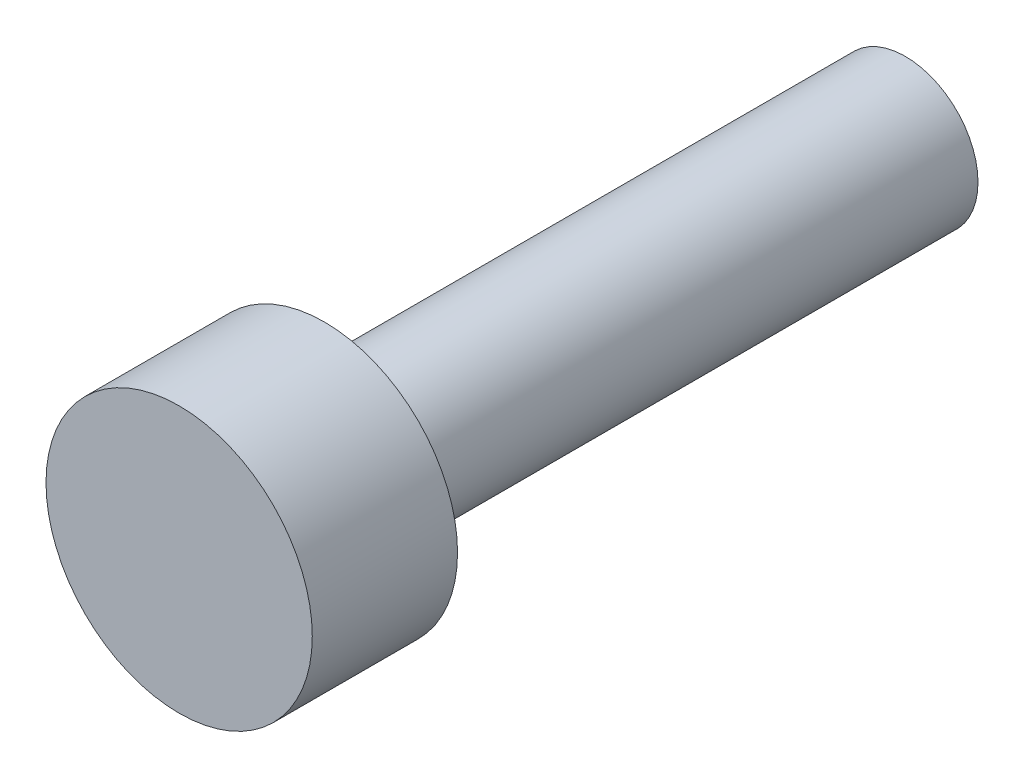
ISO-10303-21;
HEADER;
FILE_DESCRIPTION(('STEP AP214'),'2;1');
FILE_NAME('part.step','',(''),(''),'','','');
FILE_SCHEMA(('AUTOMOTIVE_DESIGN { 1 0 10303 214 1 1 1 1 }'));
ENDSEC;
DATA;
#1=APPLICATION_CONTEXT('core data for automotive mechanical design processes');
#2=APPLICATION_PROTOCOL_DEFINITION('international standard','automotive_design',2000,#1);
#3=PRODUCT_CONTEXT('',#1,'mechanical');
#4=PRODUCT('Part','Part','',(#3));
#5=PRODUCT_RELATED_PRODUCT_CATEGORY('part','',(#4));
#6=PRODUCT_DEFINITION_FORMATION('','',#4);
#7=PRODUCT_DEFINITION_CONTEXT('part definition',#1,'design');
#8=PRODUCT_DEFINITION('design','',#6,#7);
#9=PRODUCT_DEFINITION_SHAPE('','',#8);
#10=(LENGTH_UNIT() NAMED_UNIT(*) SI_UNIT(.MILLI.,.METRE.));
#11=(NAMED_UNIT(*) PLANE_ANGLE_UNIT() SI_UNIT($,.RADIAN.));
#12=(NAMED_UNIT(*) SI_UNIT($,.STERADIAN.) SOLID_ANGLE_UNIT());
#13=UNCERTAINTY_MEASURE_WITH_UNIT(LENGTH_MEASURE(1.E-05),#10,'distance_accuracy_value','');
#14=(GEOMETRIC_REPRESENTATION_CONTEXT(3) GLOBAL_UNCERTAINTY_ASSIGNED_CONTEXT((#13)) GLOBAL_UNIT_ASSIGNED_CONTEXT((#10,
#11,#12)) REPRESENTATION_CONTEXT('',''));
#15=CARTESIAN_POINT('',(0.,0.,0.));
#16=DIRECTION('',(0.,0.,1.));
#17=DIRECTION('',(1.,0.,0.));
#18=AXIS2_PLACEMENT_3D('',#15,#16,#17);
#19=CARTESIAN_POINT('',(0.,0.,0.));
#20=DIRECTION('',(0.,0.,-1.));
#21=DIRECTION('',(-1.,0.,0.));
#22=AXIS2_PLACEMENT_3D('',#19,#20,#21);
#23=CYLINDRICAL_SURFACE('',#22,1.5);
#24=CARTESIAN_POINT('',(0.,0.,0.));
#25=DIRECTION('',(0.,0.,1.));
#26=DIRECTION('',(1.,0.,0.));
#27=AXIS2_PLACEMENT_3D('',#24,#25,#26);
#28=CIRCLE('',#27,1.5);
#29=CARTESIAN_POINT('',(1.5,0.,0.));
#30=VERTEX_POINT('',#29);
#31=EDGE_CURVE('E10',#30,#30,#28,.T.);
#32=ORIENTED_EDGE('',*,*,#31,.F.);
#33=EDGE_LOOP('',(#32));
#34=FACE_BOUND('',#33,.T.);
#35=CARTESIAN_POINT('',(0.,0.,-12.));
#36=DIRECTION('',(0.,0.,1.));
#37=DIRECTION('',(1.,0.,0.));
#38=AXIS2_PLACEMENT_3D('',#35,#36,#37);
#39=CIRCLE('',#38,1.5);
#40=CARTESIAN_POINT('',(1.5,0.,-12.));
#41=VERTEX_POINT('',#40);
#42=EDGE_CURVE('E37',#41,#41,#39,.T.);
#43=ORIENTED_EDGE('',*,*,#42,.T.);
#44=EDGE_LOOP('',(#43));
#45=FACE_BOUND('',#44,.T.);
#46=ADVANCED_FACE('F40',(#34,#45),#23,.T.);
#47=CARTESIAN_POINT('',(0.,0.,-12.));
#48=DIRECTION('',(0.,0.,1.));
#49=DIRECTION('',(1.,0.,0.));
#50=AXIS2_PLACEMENT_3D('',#47,#48,#49);
#51=PLANE('',#50);
#52=ORIENTED_EDGE('',*,*,#42,.F.);
#53=EDGE_LOOP('',(#52));
#54=FACE_BOUND('',#53,.T.);
#55=ADVANCED_FACE('F58',(#54),#51,.F.);
#56=CARTESIAN_POINT('',(0.,0.,3.));
#57=DIRECTION('',(0.,0.,-1.));
#58=DIRECTION('',(-1.,0.,0.));
#59=AXIS2_PLACEMENT_3D('',#56,#57,#58);
#60=CYLINDRICAL_SURFACE('',#59,2.75);
#61=CARTESIAN_POINT('',(0.,0.,3.));
#62=DIRECTION('',(0.,0.,1.));
#63=DIRECTION('',(1.,0.,0.));
#64=AXIS2_PLACEMENT_3D('',#61,#62,#63);
#65=CIRCLE('',#64,2.75);
#66=CARTESIAN_POINT('',(2.75,0.,3.));
#67=VERTEX_POINT('',#66);
#68=EDGE_CURVE('E50',#67,#67,#65,.T.);
#69=ORIENTED_EDGE('',*,*,#68,.F.);
#70=EDGE_LOOP('',(#69));
#71=FACE_BOUND('',#70,.T.);
#72=CARTESIAN_POINT('',(0.,0.,0.));
#73=DIRECTION('',(0.,0.,1.));
#74=DIRECTION('',(1.,0.,0.));
#75=AXIS2_PLACEMENT_3D('',#72,#73,#74);
#76=CIRCLE('',#75,2.75);
#77=CARTESIAN_POINT('',(2.75,0.,0.));
#78=VERTEX_POINT('',#77);
#79=EDGE_CURVE('E47',#78,#78,#76,.T.);
#80=ORIENTED_EDGE('',*,*,#79,.T.);
#81=EDGE_LOOP('',(#80));
#82=FACE_BOUND('',#81,.T.);
#83=ADVANCED_FACE('F60',(#71,#82),#60,.T.);
#84=CARTESIAN_POINT('',(0.,0.,3.));
#85=DIRECTION('',(0.,0.,1.));
#86=DIRECTION('',(1.,0.,0.));
#87=AXIS2_PLACEMENT_3D('',#84,#85,#86);
#88=PLANE('',#87);
#89=ORIENTED_EDGE('',*,*,#68,.T.);
#90=EDGE_LOOP('',(#89));
#91=FACE_BOUND('',#90,.T.);
#92=ADVANCED_FACE('F54',(#91),#88,.T.);
#93=CARTESIAN_POINT('',(0.,0.,0.));
#94=DIRECTION('',(0.,0.,1.));
#95=DIRECTION('',(1.,0.,0.));
#96=AXIS2_PLACEMENT_3D('',#93,#94,#95);
#97=PLANE('',#96);
#98=ORIENTED_EDGE('',*,*,#31,.T.);
#99=EDGE_LOOP('',(#98));
#100=FACE_BOUND('',#99,.T.);
#101=ORIENTED_EDGE('',*,*,#79,.F.);
#102=EDGE_LOOP('',(#101));
#103=FACE_BOUND('',#102,.T.);
#104=ADVANCED_FACE('F61',(#100,#103),#97,.F.);
#105=CLOSED_SHELL('',(#46,#55,#83,#92,#104));
#106=MANIFOLD_SOLID_BREP('B2',#105);
#107=ADVANCED_BREP_SHAPE_REPRESENTATION('',(#18,#106),#14);
#108=SHAPE_DEFINITION_REPRESENTATION(#9,#107);
ENDSEC;
END-ISO-10303-21;
